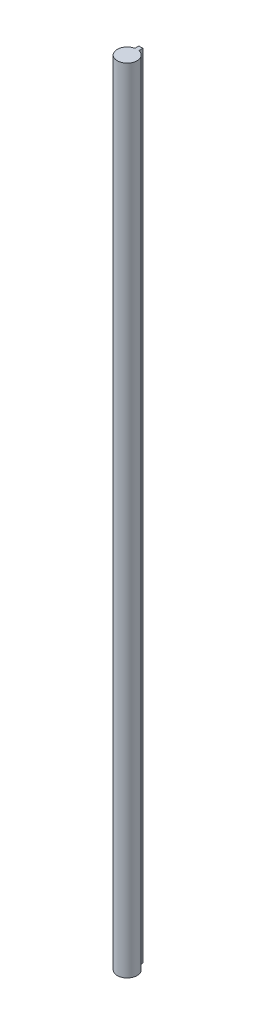
ISO-10303-21;
HEADER;
FILE_DESCRIPTION(('STEP AP214'),'2;1');
FILE_NAME('part.step','',(''),(''),'','','');
FILE_SCHEMA(('AUTOMOTIVE_DESIGN { 1 0 10303 214 1 1 1 1 }'));
ENDSEC;
DATA;
#1=APPLICATION_CONTEXT('core data for automotive mechanical design processes');
#2=APPLICATION_PROTOCOL_DEFINITION('international standard','automotive_design',2000,#1);
#3=PRODUCT_CONTEXT('',#1,'mechanical');
#4=PRODUCT('Part','Part','',(#3));
#5=PRODUCT_RELATED_PRODUCT_CATEGORY('part','',(#4));
#6=PRODUCT_DEFINITION_FORMATION('','',#4);
#7=PRODUCT_DEFINITION_CONTEXT('part definition',#1,'design');
#8=PRODUCT_DEFINITION('design','',#6,#7);
#9=PRODUCT_DEFINITION_SHAPE('','',#8);
#10=(LENGTH_UNIT() NAMED_UNIT(*) SI_UNIT(.MILLI.,.METRE.));
#11=(NAMED_UNIT(*) PLANE_ANGLE_UNIT() SI_UNIT($,.RADIAN.));
#12=(NAMED_UNIT(*) SI_UNIT($,.STERADIAN.) SOLID_ANGLE_UNIT());
#13=UNCERTAINTY_MEASURE_WITH_UNIT(LENGTH_MEASURE(1.E-05),#10,'distance_accuracy_value','');
#14=(GEOMETRIC_REPRESENTATION_CONTEXT(3) GLOBAL_UNCERTAINTY_ASSIGNED_CONTEXT((#13)) GLOBAL_UNIT_ASSIGNED_CONTEXT((#10,
#11,#12)) REPRESENTATION_CONTEXT('',''));
#15=CARTESIAN_POINT('',(0.,0.,0.));
#16=DIRECTION('',(0.,0.,1.));
#17=DIRECTION('',(1.,0.,0.));
#18=AXIS2_PLACEMENT_3D('',#15,#16,#17);
#19=CARTESIAN_POINT('',(0.,800.,0.));
#20=DIRECTION('',(0.,-1.,0.));
#21=DIRECTION('',(0.,0.,-1.));
#22=AXIS2_PLACEMENT_3D('',#19,#20,#21);
#23=CYLINDRICAL_SURFACE('',#22,10.);
#24=CARTESIAN_POINT('',(0.,0.,0.));
#25=DIRECTION('',(0.,1.,0.));
#26=DIRECTION('',(0.,0.,1.));
#27=AXIS2_PLACEMENT_3D('',#24,#25,#26);
#28=CIRCLE('',#27,10.);
#29=CARTESIAN_POINT('',(-2.,0.,-9.79795897113271));
#30=VERTEX_POINT('',#29);
#31=CARTESIAN_POINT('',(2.,0.,-9.79795897113271));
#32=VERTEX_POINT('',#31);
#33=EDGE_CURVE('E98',#30,#32,#28,.T.);
#34=ORIENTED_EDGE('',*,*,#33,.T.);
#35=DIRECTION('',(0.,-1.,0.));
#36=VECTOR('',#35,1.);
#37=CARTESIAN_POINT('',(2.,800.,-9.79795897113271));
#38=LINE('',#37,#36);
#39=CARTESIAN_POINT('',(2.,800.,-9.79795897113271));
#40=VERTEX_POINT('',#39);
#41=EDGE_CURVE('E11',#40,#32,#38,.T.);
#42=ORIENTED_EDGE('',*,*,#41,.F.);
#43=CARTESIAN_POINT('',(0.,800.,0.));
#44=DIRECTION('',(0.,1.,0.));
#45=DIRECTION('',(0.,0.,1.));
#46=AXIS2_PLACEMENT_3D('',#43,#44,#45);
#47=CIRCLE('',#46,10.);
#48=CARTESIAN_POINT('',(-2.,800.,-9.79795897113271));
#49=VERTEX_POINT('',#48);
#50=EDGE_CURVE('E86',#49,#40,#47,.T.);
#51=ORIENTED_EDGE('',*,*,#50,.F.);
#52=DIRECTION('',(0.,-1.,0.));
#53=VECTOR('',#52,1.);
#54=CARTESIAN_POINT('',(-2.,800.,-9.79795897113271));
#55=LINE('',#54,#53);
#56=EDGE_CURVE('E94',#49,#30,#55,.T.);
#57=ORIENTED_EDGE('',*,*,#56,.T.);
#58=EDGE_LOOP('',(#34,#42,#51,#57));
#59=FACE_BOUND('',#58,.T.);
#60=ADVANCED_FACE('F35',(#59),#23,.T.);
#61=CARTESIAN_POINT('',(2.,800.,-9.79795897113271));
#62=DIRECTION('',(-1.,0.,0.));
#63=DIRECTION('',(0.,0.,1.));
#64=AXIS2_PLACEMENT_3D('',#61,#62,#63);
#65=PLANE('',#64);
#66=DIRECTION('',(0.,0.,-1.));
#67=VECTOR('',#66,1.);
#68=CARTESIAN_POINT('',(2.,0.,-9.79795897113271));
#69=LINE('',#68,#67);
#70=CARTESIAN_POINT('',(2.,0.,-13.7979589711327));
#71=VERTEX_POINT('',#70);
#72=EDGE_CURVE('E90',#32,#71,#69,.T.);
#73=ORIENTED_EDGE('',*,*,#72,.T.);
#74=DIRECTION('',(0.,-1.,0.));
#75=VECTOR('',#74,1.);
#76=CARTESIAN_POINT('',(2.,800.,-13.7979589711327));
#77=LINE('',#76,#75);
#78=CARTESIAN_POINT('',(2.,800.,-13.7979589711327));
#79=VERTEX_POINT('',#78);
#80=EDGE_CURVE('E43',#79,#71,#77,.T.);
#81=ORIENTED_EDGE('',*,*,#80,.F.);
#82=DIRECTION('',(0.,0.,-1.));
#83=VECTOR('',#82,1.);
#84=CARTESIAN_POINT('',(2.,800.,-9.79795897113271));
#85=LINE('',#84,#83);
#86=EDGE_CURVE('E81',#40,#79,#85,.T.);
#87=ORIENTED_EDGE('',*,*,#86,.F.);
#88=ORIENTED_EDGE('',*,*,#41,.T.);
#89=EDGE_LOOP('',(#73,#81,#87,#88));
#90=FACE_BOUND('',#89,.T.);
#91=ADVANCED_FACE('F89',(#90),#65,.F.);
#92=CARTESIAN_POINT('',(-2.,800.,-13.7979589711327));
#93=DIRECTION('',(0.,0.,1.));
#94=DIRECTION('',(1.,0.,0.));
#95=AXIS2_PLACEMENT_3D('',#92,#93,#94);
#96=PLANE('',#95);
#97=DIRECTION('',(-1.,0.,0.));
#98=VECTOR('',#97,1.);
#99=CARTESIAN_POINT('',(-2.,0.,-13.7979589711327));
#100=LINE('',#99,#98);
#101=CARTESIAN_POINT('',(-2.,0.,-13.7979589711327));
#102=VERTEX_POINT('',#101);
#103=EDGE_CURVE('E68',#71,#102,#100,.T.);
#104=ORIENTED_EDGE('',*,*,#103,.T.);
#105=DIRECTION('',(0.,-1.,0.));
#106=VECTOR('',#105,1.);
#107=CARTESIAN_POINT('',(-2.,800.,-13.7979589711327));
#108=LINE('',#107,#106);
#109=CARTESIAN_POINT('',(-2.,800.,-13.7979589711327));
#110=VERTEX_POINT('',#109);
#111=EDGE_CURVE('E91',#110,#102,#108,.T.);
#112=ORIENTED_EDGE('',*,*,#111,.F.);
#113=DIRECTION('',(-1.,0.,0.));
#114=VECTOR('',#113,1.);
#115=CARTESIAN_POINT('',(-2.,800.,-13.7979589711327));
#116=LINE('',#115,#114);
#117=EDGE_CURVE('E84',#79,#110,#116,.T.);
#118=ORIENTED_EDGE('',*,*,#117,.F.);
#119=ORIENTED_EDGE('',*,*,#80,.T.);
#120=EDGE_LOOP('',(#104,#112,#118,#119));
#121=FACE_BOUND('',#120,.T.);
#122=ADVANCED_FACE('F92',(#121),#96,.F.);
#123=CARTESIAN_POINT('',(-2.,800.,-9.79795897113271));
#124=DIRECTION('',(1.,0.,0.));
#125=DIRECTION('',(0.,0.,-1.));
#126=AXIS2_PLACEMENT_3D('',#123,#124,#125);
#127=PLANE('',#126);
#128=DIRECTION('',(0.,0.,1.));
#129=VECTOR('',#128,1.);
#130=CARTESIAN_POINT('',(-2.,0.,-9.79795897113271));
#131=LINE('',#130,#129);
#132=EDGE_CURVE('E74',#102,#30,#131,.T.);
#133=ORIENTED_EDGE('',*,*,#132,.T.);
#134=ORIENTED_EDGE('',*,*,#56,.F.);
#135=DIRECTION('',(0.,0.,1.));
#136=VECTOR('',#135,1.);
#137=CARTESIAN_POINT('',(-2.,800.,-9.79795897113271));
#138=LINE('',#137,#136);
#139=EDGE_CURVE('E51',#110,#49,#138,.T.);
#140=ORIENTED_EDGE('',*,*,#139,.F.);
#141=ORIENTED_EDGE('',*,*,#111,.T.);
#142=EDGE_LOOP('',(#133,#134,#140,#141));
#143=FACE_BOUND('',#142,.T.);
#144=ADVANCED_FACE('F105',(#143),#127,.F.);
#145=CARTESIAN_POINT('',(0.,800.,0.));
#146=DIRECTION('',(0.,1.,0.));
#147=DIRECTION('',(0.,0.,1.));
#148=AXIS2_PLACEMENT_3D('',#145,#146,#147);
#149=PLANE('',#148);
#150=ORIENTED_EDGE('',*,*,#50,.T.);
#151=ORIENTED_EDGE('',*,*,#86,.T.);
#152=ORIENTED_EDGE('',*,*,#117,.T.);
#153=ORIENTED_EDGE('',*,*,#139,.T.);
#154=EDGE_LOOP('',(#150,#151,#152,#153));
#155=FACE_BOUND('',#154,.T.);
#156=ADVANCED_FACE('F82',(#155),#149,.T.);
#157=CARTESIAN_POINT('',(0.,0.,0.));
#158=DIRECTION('',(0.,1.,0.));
#159=DIRECTION('',(0.,0.,1.));
#160=AXIS2_PLACEMENT_3D('',#157,#158,#159);
#161=PLANE('',#160);
#162=ORIENTED_EDGE('',*,*,#33,.F.);
#163=ORIENTED_EDGE('',*,*,#132,.F.);
#164=ORIENTED_EDGE('',*,*,#103,.F.);
#165=ORIENTED_EDGE('',*,*,#72,.F.);
#166=EDGE_LOOP('',(#162,#163,#164,#165));
#167=FACE_BOUND('',#166,.T.);
#168=ADVANCED_FACE('F108',(#167),#161,.F.);
#169=CLOSED_SHELL('',(#60,#91,#122,#144,#156,#168));
#170=MANIFOLD_SOLID_BREP('B2',#169);
#171=ADVANCED_BREP_SHAPE_REPRESENTATION('',(#18,#170),#14);
#172=SHAPE_DEFINITION_REPRESENTATION(#9,#171);
ENDSEC;
END-ISO-10303-21;
